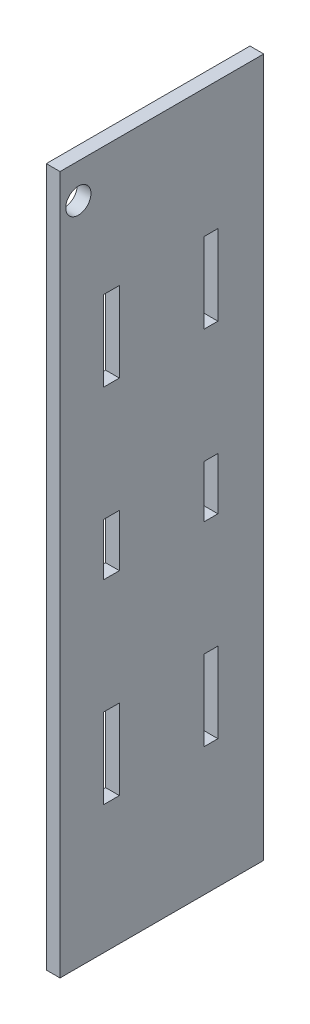
ISO-10303-21;
HEADER;
FILE_DESCRIPTION(('STEP AP214'),'2;1');
FILE_NAME('part.step','',(''),(''),'','','');
FILE_SCHEMA(('AUTOMOTIVE_DESIGN { 1 0 10303 214 1 1 1 1 }'));
ENDSEC;
DATA;
#1=APPLICATION_CONTEXT('core data for automotive mechanical design processes');
#2=APPLICATION_PROTOCOL_DEFINITION('international standard','automotive_design',2000,#1);
#3=PRODUCT_CONTEXT('',#1,'mechanical');
#4=PRODUCT('Part','Part','',(#3));
#5=PRODUCT_RELATED_PRODUCT_CATEGORY('part','',(#4));
#6=PRODUCT_DEFINITION_FORMATION('','',#4);
#7=PRODUCT_DEFINITION_CONTEXT('part definition',#1,'design');
#8=PRODUCT_DEFINITION('design','',#6,#7);
#9=PRODUCT_DEFINITION_SHAPE('','',#8);
#10=(LENGTH_UNIT() NAMED_UNIT(*) SI_UNIT(.MILLI.,.METRE.));
#11=(NAMED_UNIT(*) PLANE_ANGLE_UNIT() SI_UNIT($,.RADIAN.));
#12=(NAMED_UNIT(*) SI_UNIT($,.STERADIAN.) SOLID_ANGLE_UNIT());
#13=UNCERTAINTY_MEASURE_WITH_UNIT(LENGTH_MEASURE(1.E-05),#10,'distance_accuracy_value','');
#14=(GEOMETRIC_REPRESENTATION_CONTEXT(3) GLOBAL_UNCERTAINTY_ASSIGNED_CONTEXT((#13)) GLOBAL_UNIT_ASSIGNED_CONTEXT((#10,
#11,#12)) REPRESENTATION_CONTEXT('',''));
#15=CARTESIAN_POINT('',(0.,0.,0.));
#16=DIRECTION('',(0.,0.,1.));
#17=DIRECTION('',(1.,0.,0.));
#18=AXIS2_PLACEMENT_3D('',#15,#16,#17);
#19=CARTESIAN_POINT('',(6.,0.,0.));
#20=DIRECTION('',(1.,0.,0.));
#21=DIRECTION('',(0.,0.,-1.));
#22=AXIS2_PLACEMENT_3D('',#19,#20,#21);
#23=PLANE('',#22);
#24=DIRECTION('',(0.,1.,0.));
#25=VECTOR('',#24,1.);
#26=CARTESIAN_POINT('',(6.,164.040236686391,30.7029755262562));
#27=LINE('',#26,#25);
#28=CARTESIAN_POINT('',(6.,164.040236686391,30.7029755262562));
#29=VERTEX_POINT('',#28);
#30=CARTESIAN_POINT('',(6.,199.040236686391,30.7029755262562));
#31=VERTEX_POINT('',#30);
#32=EDGE_CURVE('E234',#29,#31,#27,.T.);
#33=ORIENTED_EDGE('',*,*,#32,.F.);
#34=DIRECTION('',(0.,0.,-1.));
#35=VECTOR('',#34,1.);
#36=CARTESIAN_POINT('',(6.,164.040236686391,30.7029755262562));
#37=LINE('',#36,#35);
#38=CARTESIAN_POINT('',(6.,164.040236686391,37.7029755262562));
#39=VERTEX_POINT('',#38);
#40=EDGE_CURVE('E226',#39,#29,#37,.T.);
#41=ORIENTED_EDGE('',*,*,#40,.F.);
#42=DIRECTION('',(0.,-1.,0.));
#43=VECTOR('',#42,1.);
#44=CARTESIAN_POINT('',(6.,164.040236686391,37.7029755262562));
#45=LINE('',#44,#43);
#46=CARTESIAN_POINT('',(6.,199.040236686391,37.7029755262562));
#47=VERTEX_POINT('',#46);
#48=EDGE_CURVE('E249',#47,#39,#45,.T.);
#49=ORIENTED_EDGE('',*,*,#48,.F.);
#50=DIRECTION('',(0.,0.,1.));
#51=VECTOR('',#50,1.);
#52=CARTESIAN_POINT('',(6.,199.040236686391,37.7029755262562));
#53=LINE('',#52,#51);
#54=EDGE_CURVE('E247',#31,#47,#53,.T.);
#55=ORIENTED_EDGE('',*,*,#54,.F.);
#56=EDGE_LOOP('',(#33,#41,#49,#55));
#57=FACE_BOUND('',#56,.T.);
#58=DIRECTION('',(0.,1.,0.));
#59=VECTOR('',#58,1.);
#60=CARTESIAN_POINT('',(6.,91.2402366863905,30.7029755262562));
#61=LINE('',#60,#59);
#62=CARTESIAN_POINT('',(6.,91.2402366863905,30.7029755262562));
#63=VERTEX_POINT('',#62);
#64=CARTESIAN_POINT('',(6.,114.040236686391,30.7029755262562));
#65=VERTEX_POINT('',#64);
#66=EDGE_CURVE('E267',#63,#65,#61,.T.);
#67=ORIENTED_EDGE('',*,*,#66,.F.);
#68=DIRECTION('',(0.,0.,-1.));
#69=VECTOR('',#68,1.);
#70=CARTESIAN_POINT('',(6.,91.2402366863905,30.7029755262562));
#71=LINE('',#70,#69);
#72=CARTESIAN_POINT('',(6.,91.2402366863905,37.7029755262562));
#73=VERTEX_POINT('',#72);
#74=EDGE_CURVE('E265',#73,#63,#71,.T.);
#75=ORIENTED_EDGE('',*,*,#74,.F.);
#76=DIRECTION('',(0.,-1.,0.));
#77=VECTOR('',#76,1.);
#78=CARTESIAN_POINT('',(6.,91.2402366863905,37.7029755262562));
#79=LINE('',#78,#77);
#80=CARTESIAN_POINT('',(6.,114.040236686391,37.7029755262562));
#81=VERTEX_POINT('',#80);
#82=EDGE_CURVE('E273',#81,#73,#79,.T.);
#83=ORIENTED_EDGE('',*,*,#82,.F.);
#84=DIRECTION('',(0.,0.,1.));
#85=VECTOR('',#84,1.);
#86=CARTESIAN_POINT('',(6.,114.040236686391,37.7029755262562));
#87=LINE('',#86,#85);
#88=EDGE_CURVE('E270',#65,#81,#87,.T.);
#89=ORIENTED_EDGE('',*,*,#88,.F.);
#90=EDGE_LOOP('',(#67,#75,#83,#89));
#91=FACE_BOUND('',#90,.T.);
#92=DIRECTION('',(0.,1.,0.));
#93=VECTOR('',#92,1.);
#94=CARTESIAN_POINT('',(6.,6.24023668639051,30.7029755262562));
#95=LINE('',#94,#93);
#96=CARTESIAN_POINT('',(6.,6.24023668639051,30.7029755262562));
#97=VERTEX_POINT('',#96);
#98=CARTESIAN_POINT('',(6.,41.2402366863905,30.7029755262562));
#99=VERTEX_POINT('',#98);
#100=EDGE_CURVE('E298',#97,#99,#95,.T.);
#101=ORIENTED_EDGE('',*,*,#100,.F.);
#102=DIRECTION('',(0.,0.,-1.));
#103=VECTOR('',#102,1.);
#104=CARTESIAN_POINT('',(6.,6.24023668639051,30.7029755262562));
#105=LINE('',#104,#103);
#106=CARTESIAN_POINT('',(6.,6.24023668639051,37.7029755262562));
#107=VERTEX_POINT('',#106);
#108=EDGE_CURVE('E296',#107,#97,#105,.T.);
#109=ORIENTED_EDGE('',*,*,#108,.F.);
#110=DIRECTION('',(0.,-1.,0.));
#111=VECTOR('',#110,1.);
#112=CARTESIAN_POINT('',(6.,6.24023668639051,37.7029755262562));
#113=LINE('',#112,#111);
#114=CARTESIAN_POINT('',(6.,41.2402366863905,37.7029755262562));
#115=VERTEX_POINT('',#114);
#116=EDGE_CURVE('E304',#115,#107,#113,.T.);
#117=ORIENTED_EDGE('',*,*,#116,.F.);
#118=DIRECTION('',(0.,0.,1.));
#119=VECTOR('',#118,1.);
#120=CARTESIAN_POINT('',(6.,41.2402366863905,37.7029755262562));
#121=LINE('',#120,#119);
#122=EDGE_CURVE('E301',#99,#115,#121,.T.);
#123=ORIENTED_EDGE('',*,*,#122,.F.);
#124=EDGE_LOOP('',(#101,#109,#117,#123));
#125=FACE_BOUND('',#124,.T.);
#126=DIRECTION('',(0.,0.,1.));
#127=VECTOR('',#126,1.);
#128=CARTESIAN_POINT('',(6.,199.040236686391,-6.29702447374375));
#129=LINE('',#128,#127);
#130=CARTESIAN_POINT('',(6.,199.040236686391,-12.2970244737438));
#131=VERTEX_POINT('',#130);
#132=CARTESIAN_POINT('',(6.,199.040236686391,-6.29702447374375));
#133=VERTEX_POINT('',#132);
#134=EDGE_CURVE('E329',#131,#133,#129,.T.);
#135=ORIENTED_EDGE('',*,*,#134,.F.);
#136=DIRECTION('',(0.,1.,0.));
#137=VECTOR('',#136,1.);
#138=CARTESIAN_POINT('',(6.,164.040236686391,-12.2970244737438));
#139=LINE('',#138,#137);
#140=CARTESIAN_POINT('',(6.,164.040236686391,-12.2970244737438));
#141=VERTEX_POINT('',#140);
#142=EDGE_CURVE('E327',#141,#131,#139,.T.);
#143=ORIENTED_EDGE('',*,*,#142,.F.);
#144=DIRECTION('',(0.,0.,-1.));
#145=VECTOR('',#144,1.);
#146=CARTESIAN_POINT('',(6.,164.040236686391,-12.2970244737438));
#147=LINE('',#146,#145);
#148=CARTESIAN_POINT('',(6.,164.040236686391,-6.29702447374375));
#149=VERTEX_POINT('',#148);
#150=EDGE_CURVE('E335',#149,#141,#147,.T.);
#151=ORIENTED_EDGE('',*,*,#150,.F.);
#152=DIRECTION('',(0.,-1.,0.));
#153=VECTOR('',#152,1.);
#154=CARTESIAN_POINT('',(6.,164.040236686391,-6.29702447374375));
#155=LINE('',#154,#153);
#156=EDGE_CURVE('E332',#133,#149,#155,.T.);
#157=ORIENTED_EDGE('',*,*,#156,.F.);
#158=EDGE_LOOP('',(#135,#143,#151,#157));
#159=FACE_BOUND('',#158,.T.);
#160=DIRECTION('',(0.,0.,1.));
#161=VECTOR('',#160,1.);
#162=CARTESIAN_POINT('',(6.,114.040236686391,-6.29702447374375));
#163=LINE('',#162,#161);
#164=CARTESIAN_POINT('',(6.,114.040236686391,-12.2970244737438));
#165=VERTEX_POINT('',#164);
#166=CARTESIAN_POINT('',(6.,114.040236686391,-6.29702447374375));
#167=VERTEX_POINT('',#166);
#168=EDGE_CURVE('E360',#165,#167,#163,.T.);
#169=ORIENTED_EDGE('',*,*,#168,.F.);
#170=DIRECTION('',(0.,1.,0.));
#171=VECTOR('',#170,1.);
#172=CARTESIAN_POINT('',(6.,91.2402366863905,-12.2970244737438));
#173=LINE('',#172,#171);
#174=CARTESIAN_POINT('',(6.,91.2402366863905,-12.2970244737438));
#175=VERTEX_POINT('',#174);
#176=EDGE_CURVE('E358',#175,#165,#173,.T.);
#177=ORIENTED_EDGE('',*,*,#176,.F.);
#178=DIRECTION('',(0.,0.,-1.));
#179=VECTOR('',#178,1.);
#180=CARTESIAN_POINT('',(6.,91.2402366863905,-12.2970244737438));
#181=LINE('',#180,#179);
#182=CARTESIAN_POINT('',(6.,91.2402366863905,-6.29702447374375));
#183=VERTEX_POINT('',#182);
#184=EDGE_CURVE('E366',#183,#175,#181,.T.);
#185=ORIENTED_EDGE('',*,*,#184,.F.);
#186=DIRECTION('',(0.,-1.,0.));
#187=VECTOR('',#186,1.);
#188=CARTESIAN_POINT('',(6.,91.2402366863905,-6.29702447374375));
#189=LINE('',#188,#187);
#190=EDGE_CURVE('E363',#167,#183,#189,.T.);
#191=ORIENTED_EDGE('',*,*,#190,.F.);
#192=EDGE_LOOP('',(#169,#177,#185,#191));
#193=FACE_BOUND('',#192,.T.);
#194=DIRECTION('',(0.,0.,1.));
#195=VECTOR('',#194,1.);
#196=CARTESIAN_POINT('',(6.,41.2402366863905,-6.29702447374375));
#197=LINE('',#196,#195);
#198=CARTESIAN_POINT('',(6.,41.2402366863905,-12.2970244737438));
#199=VERTEX_POINT('',#198);
#200=CARTESIAN_POINT('',(6.,41.2402366863905,-6.29702447374375));
#201=VERTEX_POINT('',#200);
#202=EDGE_CURVE('E391',#199,#201,#197,.T.);
#203=ORIENTED_EDGE('',*,*,#202,.F.);
#204=DIRECTION('',(0.,1.,0.));
#205=VECTOR('',#204,1.);
#206=CARTESIAN_POINT('',(6.,6.24023668639051,-12.2970244737437));
#207=LINE('',#206,#205);
#208=CARTESIAN_POINT('',(6.,6.24023668639051,-12.2970244737437));
#209=VERTEX_POINT('',#208);
#210=EDGE_CURVE('E389',#209,#199,#207,.T.);
#211=ORIENTED_EDGE('',*,*,#210,.F.);
#212=DIRECTION('',(0.,0.,-1.));
#213=VECTOR('',#212,1.);
#214=CARTESIAN_POINT('',(6.,6.24023668639051,-12.2970244737437));
#215=LINE('',#214,#213);
#216=CARTESIAN_POINT('',(6.,6.24023668639051,-6.29702447374375));
#217=VERTEX_POINT('',#216);
#218=EDGE_CURVE('E397',#217,#209,#215,.T.);
#219=ORIENTED_EDGE('',*,*,#218,.F.);
#220=DIRECTION('',(0.,-1.,0.));
#221=VECTOR('',#220,1.);
#222=CARTESIAN_POINT('',(6.,6.24023668639051,-6.29702447374375));
#223=LINE('',#222,#221);
#224=EDGE_CURVE('E394',#201,#217,#223,.T.);
#225=ORIENTED_EDGE('',*,*,#224,.F.);
#226=EDGE_LOOP('',(#203,#211,#219,#225));
#227=FACE_BOUND('',#226,.T.);
#228=DIRECTION('',(0.,0.,-1.));
#229=VECTOR('',#228,1.);
#230=CARTESIAN_POINT('',(6.,-49.7597633136095,56.6029755262562));
#231=LINE('',#230,#229);
#232=CARTESIAN_POINT('',(6.,-49.7597633136095,56.6029755262562));
#233=VERTEX_POINT('',#232);
#234=CARTESIAN_POINT('',(6.,-49.7597633136095,-32.2970244737438));
#235=VERTEX_POINT('',#234);
#236=EDGE_CURVE('E420',#233,#235,#231,.T.);
#237=ORIENTED_EDGE('',*,*,#236,.T.);
#238=DIRECTION('',(0.,1.,0.));
#239=VECTOR('',#238,1.);
#240=CARTESIAN_POINT('',(6.,-49.7597633136095,-32.2970244737438));
#241=LINE('',#240,#239);
#242=CARTESIAN_POINT('',(6.,255.040236686391,-32.2970244737438));
#243=VERTEX_POINT('',#242);
#244=EDGE_CURVE('E423',#235,#243,#241,.T.);
#245=ORIENTED_EDGE('',*,*,#244,.T.);
#246=DIRECTION('',(0.,0.,1.));
#247=VECTOR('',#246,1.);
#248=CARTESIAN_POINT('',(6.,255.040236686391,56.6029755262562));
#249=LINE('',#248,#247);
#250=CARTESIAN_POINT('',(6.,255.040236686391,56.6029755262562));
#251=VERTEX_POINT('',#250);
#252=EDGE_CURVE('E426',#243,#251,#249,.T.);
#253=ORIENTED_EDGE('',*,*,#252,.T.);
#254=DIRECTION('',(0.,-1.,0.));
#255=VECTOR('',#254,1.);
#256=CARTESIAN_POINT('',(6.,-49.7597633136095,56.6029755262562));
#257=LINE('',#256,#255);
#258=EDGE_CURVE('E428',#251,#233,#257,.T.);
#259=ORIENTED_EDGE('',*,*,#258,.T.);
#260=EDGE_LOOP('',(#237,#245,#253,#259));
#261=FACE_BOUND('',#260,.T.);
#262=CARTESIAN_POINT('',(6.,240.040236686391,48.6029755262562));
#263=DIRECTION('',(1.,0.,0.));
#264=DIRECTION('',(0.,0.,-1.));
#265=AXIS2_PLACEMENT_3D('',#262,#263,#264);
#266=CIRCLE('',#265,5.50000000000002);
#267=CARTESIAN_POINT('',(6.,240.040236686391,43.1029755262562));
#268=VERTEX_POINT('',#267);
#269=EDGE_CURVE('E255',#268,#268,#266,.T.);
#270=ORIENTED_EDGE('',*,*,#269,.F.);
#271=EDGE_LOOP('',(#270));
#272=FACE_BOUND('',#271,.T.);
#273=ADVANCED_FACE('F41',(#57,#91,#125,#159,#193,#227,#261,#272),#23,.T.);
#274=CARTESIAN_POINT('',(0.,0.,0.));
#275=DIRECTION('',(1.,0.,0.));
#276=DIRECTION('',(0.,0.,-1.));
#277=AXIS2_PLACEMENT_3D('',#274,#275,#276);
#278=PLANE('',#277);
#279=DIRECTION('',(0.,0.,-1.));
#280=VECTOR('',#279,1.);
#281=CARTESIAN_POINT('',(0.,91.2402366863905,30.7029755262562));
#282=LINE('',#281,#280);
#283=CARTESIAN_POINT('',(0.,91.2402366863905,37.7029755262562));
#284=VERTEX_POINT('',#283);
#285=CARTESIAN_POINT('',(0.,91.2402366863905,30.7029755262562));
#286=VERTEX_POINT('',#285);
#287=EDGE_CURVE('E242',#284,#286,#282,.T.);
#288=ORIENTED_EDGE('',*,*,#287,.T.);
#289=DIRECTION('',(0.,1.,0.));
#290=VECTOR('',#289,1.);
#291=CARTESIAN_POINT('',(0.,91.2402366863905,30.7029755262562));
#292=LINE('',#291,#290);
#293=CARTESIAN_POINT('',(0.,114.040236686391,30.7029755262562));
#294=VERTEX_POINT('',#293);
#295=EDGE_CURVE('E278',#286,#294,#292,.T.);
#296=ORIENTED_EDGE('',*,*,#295,.T.);
#297=DIRECTION('',(0.,0.,1.));
#298=VECTOR('',#297,1.);
#299=CARTESIAN_POINT('',(0.,114.040236686391,37.7029755262562));
#300=LINE('',#299,#298);
#301=CARTESIAN_POINT('',(0.,114.040236686391,37.7029755262562));
#302=VERTEX_POINT('',#301);
#303=EDGE_CURVE('E281',#294,#302,#300,.T.);
#304=ORIENTED_EDGE('',*,*,#303,.T.);
#305=DIRECTION('',(0.,-1.,0.));
#306=VECTOR('',#305,1.);
#307=CARTESIAN_POINT('',(0.,91.2402366863905,37.7029755262562));
#308=LINE('',#307,#306);
#309=EDGE_CURVE('E268',#302,#284,#308,.T.);
#310=ORIENTED_EDGE('',*,*,#309,.T.);
#311=EDGE_LOOP('',(#288,#296,#304,#310));
#312=FACE_BOUND('',#311,.T.);
#313=DIRECTION('',(0.,1.,0.));
#314=VECTOR('',#313,1.);
#315=CARTESIAN_POINT('',(0.,164.040236686391,-12.2970244737438));
#316=LINE('',#315,#314);
#317=CARTESIAN_POINT('',(0.,164.040236686391,-12.2970244737438));
#318=VERTEX_POINT('',#317);
#319=CARTESIAN_POINT('',(0.,199.040236686391,-12.2970244737438));
#320=VERTEX_POINT('',#319);
#321=EDGE_CURVE('E326',#318,#320,#316,.T.);
#322=ORIENTED_EDGE('',*,*,#321,.T.);
#323=DIRECTION('',(0.,0.,1.));
#324=VECTOR('',#323,1.);
#325=CARTESIAN_POINT('',(0.,199.040236686391,-6.29702447374375));
#326=LINE('',#325,#324);
#327=CARTESIAN_POINT('',(0.,199.040236686391,-6.29702447374375));
#328=VERTEX_POINT('',#327);
#329=EDGE_CURVE('E340',#320,#328,#326,.T.);
#330=ORIENTED_EDGE('',*,*,#329,.T.);
#331=DIRECTION('',(0.,-1.,0.));
#332=VECTOR('',#331,1.);
#333=CARTESIAN_POINT('',(0.,164.040236686391,-6.29702447374375));
#334=LINE('',#333,#332);
#335=CARTESIAN_POINT('',(0.,164.040236686391,-6.29702447374375));
#336=VERTEX_POINT('',#335);
#337=EDGE_CURVE('E343',#328,#336,#334,.T.);
#338=ORIENTED_EDGE('',*,*,#337,.T.);
#339=DIRECTION('',(0.,0.,-1.));
#340=VECTOR('',#339,1.);
#341=CARTESIAN_POINT('',(0.,164.040236686391,-12.2970244737438));
#342=LINE('',#341,#340);
#343=EDGE_CURVE('E330',#336,#318,#342,.T.);
#344=ORIENTED_EDGE('',*,*,#343,.T.);
#345=EDGE_LOOP('',(#322,#330,#338,#344));
#346=FACE_BOUND('',#345,.T.);
#347=DIRECTION('',(0.,1.,0.));
#348=VECTOR('',#347,1.);
#349=CARTESIAN_POINT('',(0.,6.24023668639051,-12.2970244737437));
#350=LINE('',#349,#348);
#351=CARTESIAN_POINT('',(0.,6.24023668639051,-12.2970244737437));
#352=VERTEX_POINT('',#351);
#353=CARTESIAN_POINT('',(0.,41.2402366863905,-12.2970244737438));
#354=VERTEX_POINT('',#353);
#355=EDGE_CURVE('E388',#352,#354,#350,.T.);
#356=ORIENTED_EDGE('',*,*,#355,.T.);
#357=DIRECTION('',(0.,0.,1.));
#358=VECTOR('',#357,1.);
#359=CARTESIAN_POINT('',(0.,41.2402366863905,-6.29702447374375));
#360=LINE('',#359,#358);
#361=CARTESIAN_POINT('',(0.,41.2402366863905,-6.29702447374375));
#362=VERTEX_POINT('',#361);
#363=EDGE_CURVE('E402',#354,#362,#360,.T.);
#364=ORIENTED_EDGE('',*,*,#363,.T.);
#365=DIRECTION('',(0.,-1.,0.));
#366=VECTOR('',#365,1.);
#367=CARTESIAN_POINT('',(0.,6.24023668639051,-6.29702447374375));
#368=LINE('',#367,#366);
#369=CARTESIAN_POINT('',(0.,6.24023668639051,-6.29702447374375));
#370=VERTEX_POINT('',#369);
#371=EDGE_CURVE('E405',#362,#370,#368,.T.);
#372=ORIENTED_EDGE('',*,*,#371,.T.);
#373=DIRECTION('',(0.,0.,-1.));
#374=VECTOR('',#373,1.);
#375=CARTESIAN_POINT('',(0.,6.24023668639051,-12.2970244737437));
#376=LINE('',#375,#374);
#377=EDGE_CURVE('E392',#370,#352,#376,.T.);
#378=ORIENTED_EDGE('',*,*,#377,.T.);
#379=EDGE_LOOP('',(#356,#364,#372,#378));
#380=FACE_BOUND('',#379,.T.);
#381=DIRECTION('',(0.,0.,-1.));
#382=VECTOR('',#381,1.);
#383=CARTESIAN_POINT('',(0.,-49.7597633136095,56.6029755262562));
#384=LINE('',#383,#382);
#385=CARTESIAN_POINT('',(0.,-49.7597633136095,56.6029755262562));
#386=VERTEX_POINT('',#385);
#387=CARTESIAN_POINT('',(0.,-49.7597633136095,-32.2970244737438));
#388=VERTEX_POINT('',#387);
#389=EDGE_CURVE('E419',#386,#388,#384,.T.);
#390=ORIENTED_EDGE('',*,*,#389,.F.);
#391=DIRECTION('',(0.,-1.,0.));
#392=VECTOR('',#391,1.);
#393=CARTESIAN_POINT('',(0.,-49.7597633136095,56.6029755262562));
#394=LINE('',#393,#392);
#395=CARTESIAN_POINT('',(0.,255.040236686391,56.6029755262562));
#396=VERTEX_POINT('',#395);
#397=EDGE_CURVE('E424',#396,#386,#394,.T.);
#398=ORIENTED_EDGE('',*,*,#397,.F.);
#399=DIRECTION('',(0.,0.,1.));
#400=VECTOR('',#399,1.);
#401=CARTESIAN_POINT('',(0.,255.040236686391,56.6029755262562));
#402=LINE('',#401,#400);
#403=CARTESIAN_POINT('',(0.,255.040236686391,-32.2970244737438));
#404=VERTEX_POINT('',#403);
#405=EDGE_CURVE('E435',#404,#396,#402,.T.);
#406=ORIENTED_EDGE('',*,*,#405,.F.);
#407=DIRECTION('',(0.,1.,0.));
#408=VECTOR('',#407,1.);
#409=CARTESIAN_POINT('',(0.,-49.7597633136095,-32.2970244737438));
#410=LINE('',#409,#408);
#411=EDGE_CURVE('E433',#388,#404,#410,.T.);
#412=ORIENTED_EDGE('',*,*,#411,.F.);
#413=EDGE_LOOP('',(#390,#398,#406,#412));
#414=FACE_BOUND('',#413,.T.);
#415=DIRECTION('',(0.,1.,0.));
#416=VECTOR('',#415,1.);
#417=CARTESIAN_POINT('',(0.,91.2402366863905,-12.2970244737438));
#418=LINE('',#417,#416);
#419=CARTESIAN_POINT('',(0.,91.2402366863905,-12.2970244737438));
#420=VERTEX_POINT('',#419);
#421=CARTESIAN_POINT('',(0.,114.040236686391,-12.2970244737438));
#422=VERTEX_POINT('',#421);
#423=EDGE_CURVE('E357',#420,#422,#418,.T.);
#424=ORIENTED_EDGE('',*,*,#423,.T.);
#425=DIRECTION('',(0.,0.,1.));
#426=VECTOR('',#425,1.);
#427=CARTESIAN_POINT('',(0.,114.040236686391,-6.29702447374375));
#428=LINE('',#427,#426);
#429=CARTESIAN_POINT('',(0.,114.040236686391,-6.29702447374375));
#430=VERTEX_POINT('',#429);
#431=EDGE_CURVE('E371',#422,#430,#428,.T.);
#432=ORIENTED_EDGE('',*,*,#431,.T.);
#433=DIRECTION('',(0.,-1.,0.));
#434=VECTOR('',#433,1.);
#435=CARTESIAN_POINT('',(0.,91.2402366863905,-6.29702447374375));
#436=LINE('',#435,#434);
#437=CARTESIAN_POINT('',(0.,91.2402366863905,-6.29702447374375));
#438=VERTEX_POINT('',#437);
#439=EDGE_CURVE('E374',#430,#438,#436,.T.);
#440=ORIENTED_EDGE('',*,*,#439,.T.);
#441=DIRECTION('',(0.,0.,-1.));
#442=VECTOR('',#441,1.);
#443=CARTESIAN_POINT('',(0.,91.2402366863905,-12.2970244737438));
#444=LINE('',#443,#442);
#445=EDGE_CURVE('E361',#438,#420,#444,.T.);
#446=ORIENTED_EDGE('',*,*,#445,.T.);
#447=EDGE_LOOP('',(#424,#432,#440,#446));
#448=FACE_BOUND('',#447,.T.);
#449=DIRECTION('',(0.,0.,-1.));
#450=VECTOR('',#449,1.);
#451=CARTESIAN_POINT('',(0.,6.24023668639051,30.7029755262562));
#452=LINE('',#451,#450);
#453=CARTESIAN_POINT('',(0.,6.24023668639051,37.7029755262562));
#454=VERTEX_POINT('',#453);
#455=CARTESIAN_POINT('',(0.,6.24023668639051,30.7029755262562));
#456=VERTEX_POINT('',#455);
#457=EDGE_CURVE('E295',#454,#456,#452,.T.);
#458=ORIENTED_EDGE('',*,*,#457,.T.);
#459=DIRECTION('',(0.,1.,0.));
#460=VECTOR('',#459,1.);
#461=CARTESIAN_POINT('',(0.,6.24023668639051,30.7029755262562));
#462=LINE('',#461,#460);
#463=CARTESIAN_POINT('',(0.,41.2402366863905,30.7029755262562));
#464=VERTEX_POINT('',#463);
#465=EDGE_CURVE('E309',#456,#464,#462,.T.);
#466=ORIENTED_EDGE('',*,*,#465,.T.);
#467=DIRECTION('',(0.,0.,1.));
#468=VECTOR('',#467,1.);
#469=CARTESIAN_POINT('',(0.,41.2402366863905,37.7029755262562));
#470=LINE('',#469,#468);
#471=CARTESIAN_POINT('',(0.,41.2402366863905,37.7029755262562));
#472=VERTEX_POINT('',#471);
#473=EDGE_CURVE('E312',#464,#472,#470,.T.);
#474=ORIENTED_EDGE('',*,*,#473,.T.);
#475=DIRECTION('',(0.,-1.,0.));
#476=VECTOR('',#475,1.);
#477=CARTESIAN_POINT('',(0.,6.24023668639051,37.7029755262562));
#478=LINE('',#477,#476);
#479=EDGE_CURVE('E299',#472,#454,#478,.T.);
#480=ORIENTED_EDGE('',*,*,#479,.T.);
#481=EDGE_LOOP('',(#458,#466,#474,#480));
#482=FACE_BOUND('',#481,.T.);
#483=DIRECTION('',(0.,0.,-1.));
#484=VECTOR('',#483,1.);
#485=CARTESIAN_POINT('',(0.,164.040236686391,30.7029755262562));
#486=LINE('',#485,#484);
#487=CARTESIAN_POINT('',(0.,164.040236686391,37.7029755262562));
#488=VERTEX_POINT('',#487);
#489=CARTESIAN_POINT('',(0.,164.040236686391,30.7029755262562));
#490=VERTEX_POINT('',#489);
#491=EDGE_CURVE('E64',#488,#490,#486,.T.);
#492=ORIENTED_EDGE('',*,*,#491,.T.);
#493=DIRECTION('',(0.,1.,0.));
#494=VECTOR('',#493,1.);
#495=CARTESIAN_POINT('',(0.,164.040236686391,30.7029755262562));
#496=LINE('',#495,#494);
#497=CARTESIAN_POINT('',(0.,199.040236686391,30.7029755262562));
#498=VERTEX_POINT('',#497);
#499=EDGE_CURVE('E241',#490,#498,#496,.T.);
#500=ORIENTED_EDGE('',*,*,#499,.T.);
#501=DIRECTION('',(0.,0.,1.));
#502=VECTOR('',#501,1.);
#503=CARTESIAN_POINT('',(0.,199.040236686391,37.7029755262562));
#504=LINE('',#503,#502);
#505=CARTESIAN_POINT('',(0.,199.040236686391,37.7029755262562));
#506=VERTEX_POINT('',#505);
#507=EDGE_CURVE('E257',#498,#506,#504,.T.);
#508=ORIENTED_EDGE('',*,*,#507,.T.);
#509=DIRECTION('',(0.,-1.,0.));
#510=VECTOR('',#509,1.);
#511=CARTESIAN_POINT('',(0.,164.040236686391,37.7029755262562));
#512=LINE('',#511,#510);
#513=EDGE_CURVE('E235',#506,#488,#512,.T.);
#514=ORIENTED_EDGE('',*,*,#513,.T.);
#515=EDGE_LOOP('',(#492,#500,#508,#514));
#516=FACE_BOUND('',#515,.T.);
#517=CARTESIAN_POINT('',(0.,240.040236686391,48.6029755262562));
#518=DIRECTION('',(1.,0.,0.));
#519=DIRECTION('',(0.,0.,-1.));
#520=AXIS2_PLACEMENT_3D('',#517,#518,#519);
#521=CIRCLE('',#520,5.50000000000002);
#522=CARTESIAN_POINT('',(0.,240.040236686391,43.1029755262562));
#523=VERTEX_POINT('',#522);
#524=EDGE_CURVE('E599',#523,#523,#521,.T.);
#525=ORIENTED_EDGE('',*,*,#524,.T.);
#526=EDGE_LOOP('',(#525));
#527=FACE_BOUND('',#526,.T.);
#528=ADVANCED_FACE('F453',(#312,#346,#380,#414,#448,#482,#516,#527),#278,.F.);
#529=CARTESIAN_POINT('',(6.,-49.7597633136095,56.6029755262562));
#530=DIRECTION('',(0.,1.,0.));
#531=DIRECTION('',(0.,0.,1.));
#532=AXIS2_PLACEMENT_3D('',#529,#530,#531);
#533=PLANE('',#532);
#534=ORIENTED_EDGE('',*,*,#389,.T.);
#535=DIRECTION('',(-1.,0.,0.));
#536=VECTOR('',#535,1.);
#537=CARTESIAN_POINT('',(6.,-49.7597633136095,-32.2970244737438));
#538=LINE('',#537,#536);
#539=EDGE_CURVE('E11',#235,#388,#538,.T.);
#540=ORIENTED_EDGE('',*,*,#539,.F.);
#541=ORIENTED_EDGE('',*,*,#236,.F.);
#542=DIRECTION('',(-1.,0.,0.));
#543=VECTOR('',#542,1.);
#544=CARTESIAN_POINT('',(6.,-49.7597633136095,56.6029755262562));
#545=LINE('',#544,#543);
#546=EDGE_CURVE('E430',#233,#386,#545,.T.);
#547=ORIENTED_EDGE('',*,*,#546,.T.);
#548=EDGE_LOOP('',(#534,#540,#541,#547));
#549=FACE_BOUND('',#548,.T.);
#550=ADVANCED_FACE('F43',(#549),#533,.F.);
#551=CARTESIAN_POINT('',(6.,-49.7597633136095,-32.2970244737438));
#552=DIRECTION('',(0.,0.,1.));
#553=DIRECTION('',(1.,0.,0.));
#554=AXIS2_PLACEMENT_3D('',#551,#552,#553);
#555=PLANE('',#554);
#556=ORIENTED_EDGE('',*,*,#411,.T.);
#557=DIRECTION('',(-1.,0.,0.));
#558=VECTOR('',#557,1.);
#559=CARTESIAN_POINT('',(6.,255.040236686391,-32.2970244737438));
#560=LINE('',#559,#558);
#561=EDGE_CURVE('E49',#243,#404,#560,.T.);
#562=ORIENTED_EDGE('',*,*,#561,.F.);
#563=ORIENTED_EDGE('',*,*,#244,.F.);
#564=ORIENTED_EDGE('',*,*,#539,.T.);
#565=EDGE_LOOP('',(#556,#562,#563,#564));
#566=FACE_BOUND('',#565,.T.);
#567=ADVANCED_FACE('F464',(#566),#555,.F.);
#568=CARTESIAN_POINT('',(6.,255.040236686391,56.6029755262562));
#569=DIRECTION('',(0.,-1.,0.));
#570=DIRECTION('',(0.,0.,-1.));
#571=AXIS2_PLACEMENT_3D('',#568,#569,#570);
#572=PLANE('',#571);
#573=ORIENTED_EDGE('',*,*,#405,.T.);
#574=DIRECTION('',(-1.,0.,0.));
#575=VECTOR('',#574,1.);
#576=CARTESIAN_POINT('',(6.,255.040236686391,56.6029755262562));
#577=LINE('',#576,#575);
#578=EDGE_CURVE('E440',#251,#396,#577,.T.);
#579=ORIENTED_EDGE('',*,*,#578,.F.);
#580=ORIENTED_EDGE('',*,*,#252,.F.);
#581=ORIENTED_EDGE('',*,*,#561,.T.);
#582=EDGE_LOOP('',(#573,#579,#580,#581));
#583=FACE_BOUND('',#582,.T.);
#584=ADVANCED_FACE('F447',(#583),#572,.F.);
#585=CARTESIAN_POINT('',(6.,-49.7597633136095,56.6029755262562));
#586=DIRECTION('',(0.,0.,-1.));
#587=DIRECTION('',(-1.,0.,0.));
#588=AXIS2_PLACEMENT_3D('',#585,#586,#587);
#589=PLANE('',#588);
#590=ORIENTED_EDGE('',*,*,#397,.T.);
#591=ORIENTED_EDGE('',*,*,#546,.F.);
#592=ORIENTED_EDGE('',*,*,#258,.F.);
#593=ORIENTED_EDGE('',*,*,#578,.T.);
#594=EDGE_LOOP('',(#590,#591,#592,#593));
#595=FACE_BOUND('',#594,.T.);
#596=ADVANCED_FACE('F457',(#595),#589,.F.);
#597=CARTESIAN_POINT('',(6.,6.24023668639051,-12.2970244737437));
#598=DIRECTION('',(0.,0.,1.));
#599=DIRECTION('',(0.,-1.,0.));
#600=AXIS2_PLACEMENT_3D('',#597,#598,#599);
#601=PLANE('',#600);
#602=ORIENTED_EDGE('',*,*,#355,.F.);
#603=DIRECTION('',(-1.,0.,0.));
#604=VECTOR('',#603,1.);
#605=CARTESIAN_POINT('',(6.,6.24023668639051,-12.2970244737437));
#606=LINE('',#605,#604);
#607=EDGE_CURVE('E399',#209,#352,#606,.T.);
#608=ORIENTED_EDGE('',*,*,#607,.F.);
#609=ORIENTED_EDGE('',*,*,#210,.T.);
#610=DIRECTION('',(-1.,0.,0.));
#611=VECTOR('',#610,1.);
#612=CARTESIAN_POINT('',(6.,41.2402366863905,-12.2970244737438));
#613=LINE('',#612,#611);
#614=EDGE_CURVE('E416',#199,#354,#613,.T.);
#615=ORIENTED_EDGE('',*,*,#614,.T.);
#616=EDGE_LOOP('',(#602,#608,#609,#615));
#617=FACE_BOUND('',#616,.T.);
#618=ADVANCED_FACE('F479',(#617),#601,.T.);
#619=CARTESIAN_POINT('',(6.,41.2402366863905,-6.29702447374375));
#620=DIRECTION('',(0.,-1.,0.));
#621=DIRECTION('',(0.,0.,-1.));
#622=AXIS2_PLACEMENT_3D('',#619,#620,#621);
#623=PLANE('',#622);
#624=ORIENTED_EDGE('',*,*,#363,.F.);
#625=ORIENTED_EDGE('',*,*,#614,.F.);
#626=ORIENTED_EDGE('',*,*,#202,.T.);
#627=DIRECTION('',(-1.,0.,0.));
#628=VECTOR('',#627,1.);
#629=CARTESIAN_POINT('',(6.,41.2402366863905,-6.29702447374375));
#630=LINE('',#629,#628);
#631=EDGE_CURVE('E414',#201,#362,#630,.T.);
#632=ORIENTED_EDGE('',*,*,#631,.T.);
#633=EDGE_LOOP('',(#624,#625,#626,#632));
#634=FACE_BOUND('',#633,.T.);
#635=ADVANCED_FACE('F486',(#634),#623,.T.);
#636=CARTESIAN_POINT('',(6.,6.24023668639051,-6.29702447374375));
#637=DIRECTION('',(0.,0.,-1.));
#638=DIRECTION('',(0.,1.,0.));
#639=AXIS2_PLACEMENT_3D('',#636,#637,#638);
#640=PLANE('',#639);
#641=ORIENTED_EDGE('',*,*,#371,.F.);
#642=ORIENTED_EDGE('',*,*,#631,.F.);
#643=ORIENTED_EDGE('',*,*,#224,.T.);
#644=DIRECTION('',(-1.,0.,0.));
#645=VECTOR('',#644,1.);
#646=CARTESIAN_POINT('',(6.,6.24023668639051,-6.29702447374375));
#647=LINE('',#646,#645);
#648=EDGE_CURVE('E412',#217,#370,#647,.T.);
#649=ORIENTED_EDGE('',*,*,#648,.T.);
#650=EDGE_LOOP('',(#641,#642,#643,#649));
#651=FACE_BOUND('',#650,.T.);
#652=ADVANCED_FACE('F491',(#651),#640,.T.);
#653=CARTESIAN_POINT('',(6.,6.24023668639051,-12.2970244737437));
#654=DIRECTION('',(0.,1.,0.));
#655=DIRECTION('',(0.,0.,1.));
#656=AXIS2_PLACEMENT_3D('',#653,#654,#655);
#657=PLANE('',#656);
#658=ORIENTED_EDGE('',*,*,#377,.F.);
#659=ORIENTED_EDGE('',*,*,#648,.F.);
#660=ORIENTED_EDGE('',*,*,#218,.T.);
#661=ORIENTED_EDGE('',*,*,#607,.T.);
#662=EDGE_LOOP('',(#658,#659,#660,#661));
#663=FACE_BOUND('',#662,.T.);
#664=ADVANCED_FACE('F499',(#663),#657,.T.);
#665=CARTESIAN_POINT('',(6.,91.2402366863905,-12.2970244737438));
#666=DIRECTION('',(0.,0.,1.));
#667=DIRECTION('',(1.,0.,0.));
#668=AXIS2_PLACEMENT_3D('',#665,#666,#667);
#669=PLANE('',#668);
#670=ORIENTED_EDGE('',*,*,#423,.F.);
#671=DIRECTION('',(-1.,0.,0.));
#672=VECTOR('',#671,1.);
#673=CARTESIAN_POINT('',(6.,91.2402366863905,-12.2970244737438));
#674=LINE('',#673,#672);
#675=EDGE_CURVE('E368',#175,#420,#674,.T.);
#676=ORIENTED_EDGE('',*,*,#675,.F.);
#677=ORIENTED_EDGE('',*,*,#176,.T.);
#678=DIRECTION('',(-1.,0.,0.));
#679=VECTOR('',#678,1.);
#680=CARTESIAN_POINT('',(6.,114.040236686391,-12.2970244737438));
#681=LINE('',#680,#679);
#682=EDGE_CURVE('E385',#165,#422,#681,.T.);
#683=ORIENTED_EDGE('',*,*,#682,.T.);
#684=EDGE_LOOP('',(#670,#676,#677,#683));
#685=FACE_BOUND('',#684,.T.);
#686=ADVANCED_FACE('F512',(#685),#669,.T.);
#687=CARTESIAN_POINT('',(6.,114.040236686391,-6.29702447374375));
#688=DIRECTION('',(0.,-1.,0.));
#689=DIRECTION('',(0.,0.,-1.));
#690=AXIS2_PLACEMENT_3D('',#687,#688,#689);
#691=PLANE('',#690);
#692=ORIENTED_EDGE('',*,*,#431,.F.);
#693=ORIENTED_EDGE('',*,*,#682,.F.);
#694=ORIENTED_EDGE('',*,*,#168,.T.);
#695=DIRECTION('',(-1.,0.,0.));
#696=VECTOR('',#695,1.);
#697=CARTESIAN_POINT('',(6.,114.040236686391,-6.29702447374375));
#698=LINE('',#697,#696);
#699=EDGE_CURVE('E383',#167,#430,#698,.T.);
#700=ORIENTED_EDGE('',*,*,#699,.T.);
#701=EDGE_LOOP('',(#692,#693,#694,#700));
#702=FACE_BOUND('',#701,.T.);
#703=ADVANCED_FACE('F517',(#702),#691,.T.);
#704=CARTESIAN_POINT('',(6.,91.2402366863905,-6.29702447374375));
#705=DIRECTION('',(0.,0.,-1.));
#706=DIRECTION('',(-1.,0.,0.));
#707=AXIS2_PLACEMENT_3D('',#704,#705,#706);
#708=PLANE('',#707);
#709=ORIENTED_EDGE('',*,*,#439,.F.);
#710=ORIENTED_EDGE('',*,*,#699,.F.);
#711=ORIENTED_EDGE('',*,*,#190,.T.);
#712=DIRECTION('',(-1.,0.,0.));
#713=VECTOR('',#712,1.);
#714=CARTESIAN_POINT('',(6.,91.2402366863905,-6.29702447374375));
#715=LINE('',#714,#713);
#716=EDGE_CURVE('E381',#183,#438,#715,.T.);
#717=ORIENTED_EDGE('',*,*,#716,.T.);
#718=EDGE_LOOP('',(#709,#710,#711,#717));
#719=FACE_BOUND('',#718,.T.);
#720=ADVANCED_FACE('F521',(#719),#708,.T.);
#721=CARTESIAN_POINT('',(6.,91.2402366863905,-12.2970244737438));
#722=DIRECTION('',(0.,1.,0.));
#723=DIRECTION('',(0.,0.,1.));
#724=AXIS2_PLACEMENT_3D('',#721,#722,#723);
#725=PLANE('',#724);
#726=ORIENTED_EDGE('',*,*,#445,.F.);
#727=ORIENTED_EDGE('',*,*,#716,.F.);
#728=ORIENTED_EDGE('',*,*,#184,.T.);
#729=ORIENTED_EDGE('',*,*,#675,.T.);
#730=EDGE_LOOP('',(#726,#727,#728,#729));
#731=FACE_BOUND('',#730,.T.);
#732=ADVANCED_FACE('F525',(#731),#725,.T.);
#733=CARTESIAN_POINT('',(6.,164.040236686391,-12.2970244737438));
#734=DIRECTION('',(0.,0.,1.));
#735=DIRECTION('',(1.,0.,0.));
#736=AXIS2_PLACEMENT_3D('',#733,#734,#735);
#737=PLANE('',#736);
#738=ORIENTED_EDGE('',*,*,#321,.F.);
#739=DIRECTION('',(-1.,0.,0.));
#740=VECTOR('',#739,1.);
#741=CARTESIAN_POINT('',(6.,164.040236686391,-12.2970244737438));
#742=LINE('',#741,#740);
#743=EDGE_CURVE('E337',#141,#318,#742,.T.);
#744=ORIENTED_EDGE('',*,*,#743,.F.);
#745=ORIENTED_EDGE('',*,*,#142,.T.);
#746=DIRECTION('',(-1.,0.,0.));
#747=VECTOR('',#746,1.);
#748=CARTESIAN_POINT('',(6.,199.040236686391,-12.2970244737438));
#749=LINE('',#748,#747);
#750=EDGE_CURVE('E354',#131,#320,#749,.T.);
#751=ORIENTED_EDGE('',*,*,#750,.T.);
#752=EDGE_LOOP('',(#738,#744,#745,#751));
#753=FACE_BOUND('',#752,.T.);
#754=ADVANCED_FACE('F529',(#753),#737,.T.);
#755=CARTESIAN_POINT('',(6.,199.040236686391,-6.29702447374375));
#756=DIRECTION('',(0.,-1.,0.));
#757=DIRECTION('',(0.,0.,-1.));
#758=AXIS2_PLACEMENT_3D('',#755,#756,#757);
#759=PLANE('',#758);
#760=ORIENTED_EDGE('',*,*,#329,.F.);
#761=ORIENTED_EDGE('',*,*,#750,.F.);
#762=ORIENTED_EDGE('',*,*,#134,.T.);
#763=DIRECTION('',(-1.,0.,0.));
#764=VECTOR('',#763,1.);
#765=CARTESIAN_POINT('',(6.,199.040236686391,-6.29702447374375));
#766=LINE('',#765,#764);
#767=EDGE_CURVE('E352',#133,#328,#766,.T.);
#768=ORIENTED_EDGE('',*,*,#767,.T.);
#769=EDGE_LOOP('',(#760,#761,#762,#768));
#770=FACE_BOUND('',#769,.T.);
#771=ADVANCED_FACE('F533',(#770),#759,.T.);
#772=CARTESIAN_POINT('',(6.,164.040236686391,-6.29702447374375));
#773=DIRECTION('',(0.,0.,-1.));
#774=DIRECTION('',(-1.,0.,0.));
#775=AXIS2_PLACEMENT_3D('',#772,#773,#774);
#776=PLANE('',#775);
#777=ORIENTED_EDGE('',*,*,#337,.F.);
#778=ORIENTED_EDGE('',*,*,#767,.F.);
#779=ORIENTED_EDGE('',*,*,#156,.T.);
#780=DIRECTION('',(-1.,0.,0.));
#781=VECTOR('',#780,1.);
#782=CARTESIAN_POINT('',(6.,164.040236686391,-6.29702447374375));
#783=LINE('',#782,#781);
#784=EDGE_CURVE('E350',#149,#336,#783,.T.);
#785=ORIENTED_EDGE('',*,*,#784,.T.);
#786=EDGE_LOOP('',(#777,#778,#779,#785));
#787=FACE_BOUND('',#786,.T.);
#788=ADVANCED_FACE('F537',(#787),#776,.T.);
#789=CARTESIAN_POINT('',(6.,164.040236686391,-12.2970244737438));
#790=DIRECTION('',(0.,1.,0.));
#791=DIRECTION('',(0.,0.,1.));
#792=AXIS2_PLACEMENT_3D('',#789,#790,#791);
#793=PLANE('',#792);
#794=ORIENTED_EDGE('',*,*,#343,.F.);
#795=ORIENTED_EDGE('',*,*,#784,.F.);
#796=ORIENTED_EDGE('',*,*,#150,.T.);
#797=ORIENTED_EDGE('',*,*,#743,.T.);
#798=EDGE_LOOP('',(#794,#795,#796,#797));
#799=FACE_BOUND('',#798,.T.);
#800=ADVANCED_FACE('F541',(#799),#793,.T.);
#801=CARTESIAN_POINT('',(6.,6.24023668639051,30.7029755262562));
#802=DIRECTION('',(0.,1.,0.));
#803=DIRECTION('',(0.,0.,1.));
#804=AXIS2_PLACEMENT_3D('',#801,#802,#803);
#805=PLANE('',#804);
#806=ORIENTED_EDGE('',*,*,#457,.F.);
#807=DIRECTION('',(-1.,0.,0.));
#808=VECTOR('',#807,1.);
#809=CARTESIAN_POINT('',(6.,6.24023668639051,37.7029755262562));
#810=LINE('',#809,#808);
#811=EDGE_CURVE('E306',#107,#454,#810,.T.);
#812=ORIENTED_EDGE('',*,*,#811,.F.);
#813=ORIENTED_EDGE('',*,*,#108,.T.);
#814=DIRECTION('',(-1.,0.,0.));
#815=VECTOR('',#814,1.);
#816=CARTESIAN_POINT('',(6.,6.24023668639051,30.7029755262562));
#817=LINE('',#816,#815);
#818=EDGE_CURVE('E323',#97,#456,#817,.T.);
#819=ORIENTED_EDGE('',*,*,#818,.T.);
#820=EDGE_LOOP('',(#806,#812,#813,#819));
#821=FACE_BOUND('',#820,.T.);
#822=ADVANCED_FACE('F545',(#821),#805,.T.);
#823=CARTESIAN_POINT('',(6.,6.24023668639051,30.7029755262562));
#824=DIRECTION('',(0.,0.,1.));
#825=DIRECTION('',(1.,0.,0.));
#826=AXIS2_PLACEMENT_3D('',#823,#824,#825);
#827=PLANE('',#826);
#828=ORIENTED_EDGE('',*,*,#465,.F.);
#829=ORIENTED_EDGE('',*,*,#818,.F.);
#830=ORIENTED_EDGE('',*,*,#100,.T.);
#831=DIRECTION('',(-1.,0.,0.));
#832=VECTOR('',#831,1.);
#833=CARTESIAN_POINT('',(6.,41.2402366863905,30.7029755262562));
#834=LINE('',#833,#832);
#835=EDGE_CURVE('E321',#99,#464,#834,.T.);
#836=ORIENTED_EDGE('',*,*,#835,.T.);
#837=EDGE_LOOP('',(#828,#829,#830,#836));
#838=FACE_BOUND('',#837,.T.);
#839=ADVANCED_FACE('F549',(#838),#827,.T.);
#840=CARTESIAN_POINT('',(6.,41.2402366863905,37.7029755262562));
#841=DIRECTION('',(0.,-1.,0.));
#842=DIRECTION('',(0.,0.,-1.));
#843=AXIS2_PLACEMENT_3D('',#840,#841,#842);
#844=PLANE('',#843);
#845=ORIENTED_EDGE('',*,*,#473,.F.);
#846=ORIENTED_EDGE('',*,*,#835,.F.);
#847=ORIENTED_EDGE('',*,*,#122,.T.);
#848=DIRECTION('',(-1.,0.,0.));
#849=VECTOR('',#848,1.);
#850=CARTESIAN_POINT('',(6.,41.2402366863905,37.7029755262562));
#851=LINE('',#850,#849);
#852=EDGE_CURVE('E319',#115,#472,#851,.T.);
#853=ORIENTED_EDGE('',*,*,#852,.T.);
#854=EDGE_LOOP('',(#845,#846,#847,#853));
#855=FACE_BOUND('',#854,.T.);
#856=ADVANCED_FACE('F553',(#855),#844,.T.);
#857=CARTESIAN_POINT('',(6.,6.24023668639051,37.7029755262562));
#858=DIRECTION('',(0.,0.,-1.));
#859=DIRECTION('',(-1.,0.,0.));
#860=AXIS2_PLACEMENT_3D('',#857,#858,#859);
#861=PLANE('',#860);
#862=ORIENTED_EDGE('',*,*,#479,.F.);
#863=ORIENTED_EDGE('',*,*,#852,.F.);
#864=ORIENTED_EDGE('',*,*,#116,.T.);
#865=ORIENTED_EDGE('',*,*,#811,.T.);
#866=EDGE_LOOP('',(#862,#863,#864,#865));
#867=FACE_BOUND('',#866,.T.);
#868=ADVANCED_FACE('F557',(#867),#861,.T.);
#869=CARTESIAN_POINT('',(6.,91.2402366863905,30.7029755262562));
#870=DIRECTION('',(0.,1.,0.));
#871=DIRECTION('',(0.,0.,1.));
#872=AXIS2_PLACEMENT_3D('',#869,#870,#871);
#873=PLANE('',#872);
#874=ORIENTED_EDGE('',*,*,#287,.F.);
#875=DIRECTION('',(-1.,0.,0.));
#876=VECTOR('',#875,1.);
#877=CARTESIAN_POINT('',(6.,91.2402366863905,37.7029755262562));
#878=LINE('',#877,#876);
#879=EDGE_CURVE('E275',#73,#284,#878,.T.);
#880=ORIENTED_EDGE('',*,*,#879,.F.);
#881=ORIENTED_EDGE('',*,*,#74,.T.);
#882=DIRECTION('',(-1.,0.,0.));
#883=VECTOR('',#882,1.);
#884=CARTESIAN_POINT('',(6.,91.2402366863905,30.7029755262562));
#885=LINE('',#884,#883);
#886=EDGE_CURVE('E292',#63,#286,#885,.T.);
#887=ORIENTED_EDGE('',*,*,#886,.T.);
#888=EDGE_LOOP('',(#874,#880,#881,#887));
#889=FACE_BOUND('',#888,.T.);
#890=ADVANCED_FACE('F561',(#889),#873,.T.);
#891=CARTESIAN_POINT('',(6.,91.2402366863905,30.7029755262562));
#892=DIRECTION('',(0.,0.,1.));
#893=DIRECTION('',(1.,0.,0.));
#894=AXIS2_PLACEMENT_3D('',#891,#892,#893);
#895=PLANE('',#894);
#896=ORIENTED_EDGE('',*,*,#295,.F.);
#897=ORIENTED_EDGE('',*,*,#886,.F.);
#898=ORIENTED_EDGE('',*,*,#66,.T.);
#899=DIRECTION('',(-1.,0.,0.));
#900=VECTOR('',#899,1.);
#901=CARTESIAN_POINT('',(6.,114.040236686391,30.7029755262562));
#902=LINE('',#901,#900);
#903=EDGE_CURVE('E290',#65,#294,#902,.T.);
#904=ORIENTED_EDGE('',*,*,#903,.T.);
#905=EDGE_LOOP('',(#896,#897,#898,#904));
#906=FACE_BOUND('',#905,.T.);
#907=ADVANCED_FACE('F565',(#906),#895,.T.);
#908=CARTESIAN_POINT('',(6.,114.040236686391,37.7029755262562));
#909=DIRECTION('',(0.,-1.,0.));
#910=DIRECTION('',(0.,0.,-1.));
#911=AXIS2_PLACEMENT_3D('',#908,#909,#910);
#912=PLANE('',#911);
#913=ORIENTED_EDGE('',*,*,#303,.F.);
#914=ORIENTED_EDGE('',*,*,#903,.F.);
#915=ORIENTED_EDGE('',*,*,#88,.T.);
#916=DIRECTION('',(-1.,0.,0.));
#917=VECTOR('',#916,1.);
#918=CARTESIAN_POINT('',(6.,114.040236686391,37.7029755262562));
#919=LINE('',#918,#917);
#920=EDGE_CURVE('E288',#81,#302,#919,.T.);
#921=ORIENTED_EDGE('',*,*,#920,.T.);
#922=EDGE_LOOP('',(#913,#914,#915,#921));
#923=FACE_BOUND('',#922,.T.);
#924=ADVANCED_FACE('F569',(#923),#912,.T.);
#925=CARTESIAN_POINT('',(6.,91.2402366863905,37.7029755262562));
#926=DIRECTION('',(0.,0.,-1.));
#927=DIRECTION('',(-1.,0.,0.));
#928=AXIS2_PLACEMENT_3D('',#925,#926,#927);
#929=PLANE('',#928);
#930=ORIENTED_EDGE('',*,*,#309,.F.);
#931=ORIENTED_EDGE('',*,*,#920,.F.);
#932=ORIENTED_EDGE('',*,*,#82,.T.);
#933=ORIENTED_EDGE('',*,*,#879,.T.);
#934=EDGE_LOOP('',(#930,#931,#932,#933));
#935=FACE_BOUND('',#934,.T.);
#936=ADVANCED_FACE('F573',(#935),#929,.T.);
#937=CARTESIAN_POINT('',(6.,164.040236686391,30.7029755262562));
#938=DIRECTION('',(0.,1.,0.));
#939=DIRECTION('',(0.,0.,1.));
#940=AXIS2_PLACEMENT_3D('',#937,#938,#939);
#941=PLANE('',#940);
#942=ORIENTED_EDGE('',*,*,#491,.F.);
#943=DIRECTION('',(-1.,0.,0.));
#944=VECTOR('',#943,1.);
#945=CARTESIAN_POINT('',(6.,164.040236686391,37.7029755262562));
#946=LINE('',#945,#944);
#947=EDGE_CURVE('E230',#39,#488,#946,.T.);
#948=ORIENTED_EDGE('',*,*,#947,.F.);
#949=ORIENTED_EDGE('',*,*,#40,.T.);
#950=DIRECTION('',(-1.,0.,0.));
#951=VECTOR('',#950,1.);
#952=CARTESIAN_POINT('',(6.,164.040236686391,30.7029755262562));
#953=LINE('',#952,#951);
#954=EDGE_CURVE('E229',#29,#490,#953,.T.);
#955=ORIENTED_EDGE('',*,*,#954,.T.);
#956=EDGE_LOOP('',(#942,#948,#949,#955));
#957=FACE_BOUND('',#956,.T.);
#958=ADVANCED_FACE('F228',(#957),#941,.T.);
#959=CARTESIAN_POINT('',(6.,164.040236686391,30.7029755262562));
#960=DIRECTION('',(0.,0.,1.));
#961=DIRECTION('',(1.,0.,0.));
#962=AXIS2_PLACEMENT_3D('',#959,#960,#961);
#963=PLANE('',#962);
#964=ORIENTED_EDGE('',*,*,#499,.F.);
#965=ORIENTED_EDGE('',*,*,#954,.F.);
#966=ORIENTED_EDGE('',*,*,#32,.T.);
#967=DIRECTION('',(-1.,0.,0.));
#968=VECTOR('',#967,1.);
#969=CARTESIAN_POINT('',(6.,199.040236686391,30.7029755262562));
#970=LINE('',#969,#968);
#971=EDGE_CURVE('E243',#31,#498,#970,.T.);
#972=ORIENTED_EDGE('',*,*,#971,.T.);
#973=EDGE_LOOP('',(#964,#965,#966,#972));
#974=FACE_BOUND('',#973,.T.);
#975=ADVANCED_FACE('F238',(#974),#963,.T.);
#976=CARTESIAN_POINT('',(6.,199.040236686391,37.7029755262562));
#977=DIRECTION('',(0.,-1.,0.));
#978=DIRECTION('',(0.,0.,-1.));
#979=AXIS2_PLACEMENT_3D('',#976,#977,#978);
#980=PLANE('',#979);
#981=ORIENTED_EDGE('',*,*,#507,.F.);
#982=ORIENTED_EDGE('',*,*,#971,.F.);
#983=ORIENTED_EDGE('',*,*,#54,.T.);
#984=DIRECTION('',(-1.,0.,0.));
#985=VECTOR('',#984,1.);
#986=CARTESIAN_POINT('',(6.,199.040236686391,37.7029755262562));
#987=LINE('',#986,#985);
#988=EDGE_CURVE('E56',#47,#506,#987,.T.);
#989=ORIENTED_EDGE('',*,*,#988,.T.);
#990=EDGE_LOOP('',(#981,#982,#983,#989));
#991=FACE_BOUND('',#990,.T.);
#992=ADVANCED_FACE('F582',(#991),#980,.T.);
#993=CARTESIAN_POINT('',(6.,164.040236686391,37.7029755262562));
#994=DIRECTION('',(0.,0.,-1.));
#995=DIRECTION('',(-1.,0.,0.));
#996=AXIS2_PLACEMENT_3D('',#993,#994,#995);
#997=PLANE('',#996);
#998=ORIENTED_EDGE('',*,*,#513,.F.);
#999=ORIENTED_EDGE('',*,*,#988,.F.);
#1000=ORIENTED_EDGE('',*,*,#48,.T.);
#1001=ORIENTED_EDGE('',*,*,#947,.T.);
#1002=EDGE_LOOP('',(#998,#999,#1000,#1001));
#1003=FACE_BOUND('',#1002,.T.);
#1004=ADVANCED_FACE('F585',(#1003),#997,.T.);
#1005=CARTESIAN_POINT('',(6.,240.040236686391,48.6029755262562));
#1006=DIRECTION('',(-1.,0.,0.));
#1007=DIRECTION('',(0.,0.,1.));
#1008=AXIS2_PLACEMENT_3D('',#1005,#1006,#1007);
#1009=CYLINDRICAL_SURFACE('',#1008,5.50000000000002);
#1010=ORIENTED_EDGE('',*,*,#269,.T.);
#1011=EDGE_LOOP('',(#1010));
#1012=FACE_BOUND('',#1011,.T.);
#1013=ORIENTED_EDGE('',*,*,#524,.F.);
#1014=EDGE_LOOP('',(#1013));
#1015=FACE_BOUND('',#1014,.T.);
#1016=ADVANCED_FACE('F589',(#1012,#1015),#1009,.F.);
#1017=CLOSED_SHELL('',(#273,#528,#550,#567,#584,#596,#618,#635,#652,#664,#686,#703,#720,#732,
#754,#771,#788,#800,#822,#839,#856,#868,#890,#907,#924,#936,#958,#975,#992,#1004,#1016));
#1018=MANIFOLD_SOLID_BREP('B2',#1017);
#1019=ADVANCED_BREP_SHAPE_REPRESENTATION('',(#18,#1018),#14);
#1020=SHAPE_DEFINITION_REPRESENTATION(#9,#1019);
ENDSEC;
END-ISO-10303-21;
